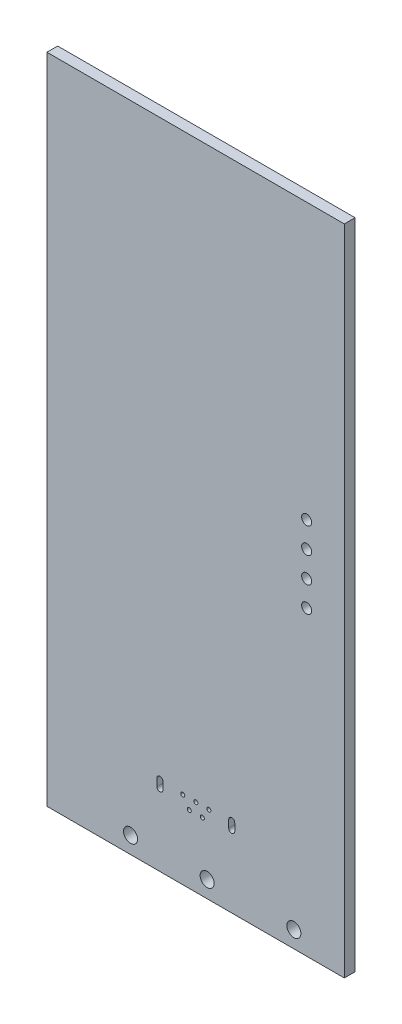
ISO-10303-21;
HEADER;
FILE_DESCRIPTION(('STEP AP214'),'2;1');
FILE_NAME('part.step','',(''),(''),'','','');
FILE_SCHEMA(('AUTOMOTIVE_DESIGN { 1 0 10303 214 1 1 1 1 }'));
ENDSEC;
DATA;
#1=APPLICATION_CONTEXT('core data for automotive mechanical design processes');
#2=APPLICATION_PROTOCOL_DEFINITION('international standard','automotive_design',2000,#1);
#3=PRODUCT_CONTEXT('',#1,'mechanical');
#4=PRODUCT('Part','Part','',(#3));
#5=PRODUCT_RELATED_PRODUCT_CATEGORY('part','',(#4));
#6=PRODUCT_DEFINITION_FORMATION('','',#4);
#7=PRODUCT_DEFINITION_CONTEXT('part definition',#1,'design');
#8=PRODUCT_DEFINITION('design','',#6,#7);
#9=PRODUCT_DEFINITION_SHAPE('','',#8);
#10=(LENGTH_UNIT() NAMED_UNIT(*) SI_UNIT(.MILLI.,.METRE.));
#11=(NAMED_UNIT(*) PLANE_ANGLE_UNIT() SI_UNIT($,.RADIAN.));
#12=(NAMED_UNIT(*) SI_UNIT($,.STERADIAN.) SOLID_ANGLE_UNIT());
#13=UNCERTAINTY_MEASURE_WITH_UNIT(LENGTH_MEASURE(1.E-05),#10,'distance_accuracy_value','');
#14=(GEOMETRIC_REPRESENTATION_CONTEXT(3) GLOBAL_UNCERTAINTY_ASSIGNED_CONTEXT((#13)) GLOBAL_UNIT_ASSIGNED_CONTEXT((#10,
#11,#12)) REPRESENTATION_CONTEXT('',''));
#15=CARTESIAN_POINT('',(0.,0.,0.));
#16=DIRECTION('',(0.,0.,1.));
#17=DIRECTION('',(1.,0.,0.));
#18=AXIS2_PLACEMENT_3D('',#15,#16,#17);
#19=CARTESIAN_POINT('',(86.68103,54.08662,1.07112));
#20=DIRECTION('',(-1.,0.,0.));
#21=DIRECTION('',(0.,0.,1.));
#22=AXIS2_PLACEMENT_3D('',#19,#20,#21);
#23=PLANE('',#22);
#24=DIRECTION('',(0.,1.,0.));
#25=VECTOR('',#24,1.);
#26=CARTESIAN_POINT('',(86.68103,54.08662,0.));
#27=LINE('',#26,#25);
#28=CARTESIAN_POINT('',(86.68103,54.08662,0.));
#29=VERTEX_POINT('',#28);
#30=CARTESIAN_POINT('',(86.68103,119.08662,0.));
#31=VERTEX_POINT('',#30);
#32=EDGE_CURVE('E247',#29,#31,#27,.T.);
#33=ORIENTED_EDGE('',*,*,#32,.T.);
#34=DIRECTION('',(0.,0.,-1.));
#35=VECTOR('',#34,1.);
#36=CARTESIAN_POINT('',(86.68103,119.08662,1.07112));
#37=LINE('',#36,#35);
#38=CARTESIAN_POINT('',(86.68103,119.08662,1.07112));
#39=VERTEX_POINT('',#38);
#40=EDGE_CURVE('E13',#39,#31,#37,.T.);
#41=ORIENTED_EDGE('',*,*,#40,.F.);
#42=DIRECTION('',(0.,1.,0.));
#43=VECTOR('',#42,1.);
#44=CARTESIAN_POINT('',(86.68103,54.08662,1.07112));
#45=LINE('',#44,#43);
#46=CARTESIAN_POINT('',(86.68103,54.08662,1.07112));
#47=VERTEX_POINT('',#46);
#48=EDGE_CURVE('E250',#47,#39,#45,.T.);
#49=ORIENTED_EDGE('',*,*,#48,.F.);
#50=DIRECTION('',(0.,0.,-1.));
#51=VECTOR('',#50,1.);
#52=CARTESIAN_POINT('',(86.68103,54.08662,1.07112));
#53=LINE('',#52,#51);
#54=EDGE_CURVE('E260',#47,#29,#53,.T.);
#55=ORIENTED_EDGE('',*,*,#54,.T.);
#56=EDGE_LOOP('',(#33,#41,#49,#55));
#57=FACE_BOUND('',#56,.T.);
#58=ADVANCED_FACE('F47',(#57),#23,.F.);
#59=CARTESIAN_POINT('',(86.68103,119.08662,1.07112));
#60=DIRECTION('',(0.,-1.,0.));
#61=DIRECTION('',(0.,0.,-1.));
#62=AXIS2_PLACEMENT_3D('',#59,#60,#61);
#63=PLANE('',#62);
#64=DIRECTION('',(-1.,0.,0.));
#65=VECTOR('',#64,1.);
#66=CARTESIAN_POINT('',(86.68103,119.08662,0.));
#67=LINE('',#66,#65);
#68=CARTESIAN_POINT('',(57.08103,119.08662,0.));
#69=VERTEX_POINT('',#68);
#70=EDGE_CURVE('E263',#31,#69,#67,.T.);
#71=ORIENTED_EDGE('',*,*,#70,.T.);
#72=DIRECTION('',(0.,0.,-1.));
#73=VECTOR('',#72,1.);
#74=CARTESIAN_POINT('',(57.08103,119.08662,1.07112));
#75=LINE('',#74,#73);
#76=CARTESIAN_POINT('',(57.08103,119.08662,1.07112));
#77=VERTEX_POINT('',#76);
#78=EDGE_CURVE('E54',#77,#69,#75,.T.);
#79=ORIENTED_EDGE('',*,*,#78,.F.);
#80=DIRECTION('',(-1.,0.,0.));
#81=VECTOR('',#80,1.);
#82=CARTESIAN_POINT('',(86.68103,119.08662,1.07112));
#83=LINE('',#82,#81);
#84=EDGE_CURVE('E253',#39,#77,#83,.T.);
#85=ORIENTED_EDGE('',*,*,#84,.F.);
#86=ORIENTED_EDGE('',*,*,#40,.T.);
#87=EDGE_LOOP('',(#71,#79,#85,#86));
#88=FACE_BOUND('',#87,.T.);
#89=ADVANCED_FACE('F292',(#88),#63,.F.);
#90=CARTESIAN_POINT('',(57.08103,119.08662,1.07112));
#91=DIRECTION('',(1.,0.,0.));
#92=DIRECTION('',(0.,0.,-1.));
#93=AXIS2_PLACEMENT_3D('',#90,#91,#92);
#94=PLANE('',#93);
#95=DIRECTION('',(0.,-1.,0.));
#96=VECTOR('',#95,1.);
#97=CARTESIAN_POINT('',(57.08103,119.08662,0.));
#98=LINE('',#97,#96);
#99=CARTESIAN_POINT('',(57.08103,54.08662,0.));
#100=VERTEX_POINT('',#99);
#101=EDGE_CURVE('E265',#69,#100,#98,.T.);
#102=ORIENTED_EDGE('',*,*,#101,.T.);
#103=DIRECTION('',(0.,0.,-1.));
#104=VECTOR('',#103,1.);
#105=CARTESIAN_POINT('',(57.08103,54.08662,1.07112));
#106=LINE('',#105,#104);
#107=CARTESIAN_POINT('',(57.08103,54.08662,1.07112));
#108=VERTEX_POINT('',#107);
#109=EDGE_CURVE('E270',#108,#100,#106,.T.);
#110=ORIENTED_EDGE('',*,*,#109,.F.);
#111=DIRECTION('',(0.,-1.,0.));
#112=VECTOR('',#111,1.);
#113=CARTESIAN_POINT('',(57.08103,119.08662,1.07112));
#114=LINE('',#113,#112);
#115=EDGE_CURVE('E256',#77,#108,#114,.T.);
#116=ORIENTED_EDGE('',*,*,#115,.F.);
#117=ORIENTED_EDGE('',*,*,#78,.T.);
#118=EDGE_LOOP('',(#102,#110,#116,#117));
#119=FACE_BOUND('',#118,.T.);
#120=ADVANCED_FACE('F277',(#119),#94,.F.);
#121=CARTESIAN_POINT('',(57.08103,54.08662,1.07112));
#122=DIRECTION('',(0.,1.,0.));
#123=DIRECTION('',(0.,0.,1.));
#124=AXIS2_PLACEMENT_3D('',#121,#122,#123);
#125=PLANE('',#124);
#126=DIRECTION('',(1.,0.,0.));
#127=VECTOR('',#126,1.);
#128=CARTESIAN_POINT('',(57.08103,54.08662,0.));
#129=LINE('',#128,#127);
#130=EDGE_CURVE('E254',#100,#29,#129,.T.);
#131=ORIENTED_EDGE('',*,*,#130,.T.);
#132=ORIENTED_EDGE('',*,*,#54,.F.);
#133=DIRECTION('',(1.,0.,0.));
#134=VECTOR('',#133,1.);
#135=CARTESIAN_POINT('',(57.08103,54.08662,1.07112));
#136=LINE('',#135,#134);
#137=EDGE_CURVE('E258',#108,#47,#136,.T.);
#138=ORIENTED_EDGE('',*,*,#137,.F.);
#139=ORIENTED_EDGE('',*,*,#109,.T.);
#140=EDGE_LOOP('',(#131,#132,#138,#139));
#141=FACE_BOUND('',#140,.T.);
#142=ADVANCED_FACE('F285',(#141),#125,.F.);
#143=CARTESIAN_POINT('',(0.,0.,1.07112));
#144=DIRECTION('',(0.,0.,1.));
#145=DIRECTION('',(1.,0.,0.));
#146=AXIS2_PLACEMENT_3D('',#143,#144,#145);
#147=PLANE('',#146);
#148=CARTESIAN_POINT('',(73.20089,61.85158,1.07112));
#149=DIRECTION('',(0.,0.,1.));
#150=DIRECTION('',(1.,0.,0.));
#151=AXIS2_PLACEMENT_3D('',#148,#149,#150);
#152=CIRCLE('',#151,0.200000000000006);
#153=CARTESIAN_POINT('',(73.40089,61.85158,1.07112));
#154=VERTEX_POINT('',#153);
#155=EDGE_CURVE('E390',#154,#154,#152,.T.);
#156=ORIENTED_EDGE('',*,*,#155,.F.);
#157=EDGE_LOOP('',(#156));
#158=FACE_BOUND('',#157,.T.);
#159=CARTESIAN_POINT('',(72.55091,60.85157,1.07112));
#160=DIRECTION('',(0.,0.,1.));
#161=DIRECTION('',(1.,0.,0.));
#162=AXIS2_PLACEMENT_3D('',#159,#160,#161);
#163=CIRCLE('',#162,0.200000000000006);
#164=CARTESIAN_POINT('',(72.75091,60.85157,1.07112));
#165=VERTEX_POINT('',#164);
#166=EDGE_CURVE('E392',#165,#165,#163,.T.);
#167=ORIENTED_EDGE('',*,*,#166,.F.);
#168=EDGE_LOOP('',(#167));
#169=FACE_BOUND('',#168,.T.);
#170=CARTESIAN_POINT('',(71.90091,61.85157,1.07112));
#171=DIRECTION('',(0.,0.,1.));
#172=DIRECTION('',(1.,0.,0.));
#173=AXIS2_PLACEMENT_3D('',#170,#171,#172);
#174=CIRCLE('',#173,0.200000000000006);
#175=CARTESIAN_POINT('',(72.10091,61.85157,1.07112));
#176=VERTEX_POINT('',#175);
#177=EDGE_CURVE('E398',#176,#176,#174,.T.);
#178=ORIENTED_EDGE('',*,*,#177,.F.);
#179=EDGE_LOOP('',(#178));
#180=FACE_BOUND('',#179,.T.);
#181=CARTESIAN_POINT('',(71.25089,60.85157,1.07112));
#182=DIRECTION('',(0.,0.,1.));
#183=DIRECTION('',(1.,0.,0.));
#184=AXIS2_PLACEMENT_3D('',#181,#182,#183);
#185=CIRCLE('',#184,0.200000000000006);
#186=CARTESIAN_POINT('',(71.45089,60.85157,1.07112));
#187=VERTEX_POINT('',#186);
#188=EDGE_CURVE('E404',#187,#187,#185,.T.);
#189=ORIENTED_EDGE('',*,*,#188,.F.);
#190=EDGE_LOOP('',(#189));
#191=FACE_BOUND('',#190,.T.);
#192=CARTESIAN_POINT('',(70.6009,61.85156,1.07112));
#193=DIRECTION('',(0.,0.,1.));
#194=DIRECTION('',(1.,0.,0.));
#195=AXIS2_PLACEMENT_3D('',#192,#193,#194);
#196=CIRCLE('',#195,0.200000000000006);
#197=CARTESIAN_POINT('',(70.8009,61.85156,1.07112));
#198=VERTEX_POINT('',#197);
#199=EDGE_CURVE('E159',#198,#198,#196,.T.);
#200=ORIENTED_EDGE('',*,*,#199,.F.);
#201=EDGE_LOOP('',(#200));
#202=FACE_BOUND('',#201,.T.);
#203=CARTESIAN_POINT('',(75.47589,61.25658,1.07112));
#204=DIRECTION('',(0.,0.,1.));
#205=DIRECTION('',(1.,0.,0.));
#206=AXIS2_PLACEMENT_3D('',#203,#204,#205);
#207=CIRCLE('',#206,0.299999999999995);
#208=CARTESIAN_POINT('',(75.17589,61.25658,1.07112));
#209=VERTEX_POINT('',#208);
#210=CARTESIAN_POINT('',(75.77589,61.25658,1.07112));
#211=VERTEX_POINT('',#210);
#212=EDGE_CURVE('E61',#209,#211,#207,.T.);
#213=ORIENTED_EDGE('',*,*,#212,.F.);
#214=DIRECTION('',(0.,-1.,0.));
#215=VECTOR('',#214,1.);
#216=CARTESIAN_POINT('',(75.17589,61.25658,1.07112));
#217=LINE('',#216,#215);
#218=CARTESIAN_POINT('',(75.17589,62.00658,1.07112));
#219=VERTEX_POINT('',#218);
#220=EDGE_CURVE('E153',#219,#209,#217,.T.);
#221=ORIENTED_EDGE('',*,*,#220,.F.);
#222=CARTESIAN_POINT('',(75.47589,62.00658,1.07112));
#223=DIRECTION('',(0.,0.,1.));
#224=DIRECTION('',(1.,0.,0.));
#225=AXIS2_PLACEMENT_3D('',#222,#223,#224);
#226=CIRCLE('',#225,0.299999999999995);
#227=CARTESIAN_POINT('',(75.77589,62.00658,1.07112));
#228=VERTEX_POINT('',#227);
#229=EDGE_CURVE('E156',#228,#219,#226,.T.);
#230=ORIENTED_EDGE('',*,*,#229,.F.);
#231=DIRECTION('',(0.,1.,0.));
#232=VECTOR('',#231,1.);
#233=CARTESIAN_POINT('',(75.77589,61.25658,1.07112));
#234=LINE('',#233,#232);
#235=EDGE_CURVE('E165',#211,#228,#234,.T.);
#236=ORIENTED_EDGE('',*,*,#235,.F.);
#237=EDGE_LOOP('',(#213,#221,#230,#236));
#238=FACE_BOUND('',#237,.T.);
#239=CARTESIAN_POINT('',(68.3259,61.25658,1.07112));
#240=DIRECTION('',(0.,0.,1.));
#241=DIRECTION('',(1.,0.,0.));
#242=AXIS2_PLACEMENT_3D('',#239,#240,#241);
#243=CIRCLE('',#242,0.299999999999995);
#244=CARTESIAN_POINT('',(68.0259,61.25658,1.07112));
#245=VERTEX_POINT('',#244);
#246=CARTESIAN_POINT('',(68.6259,61.25658,1.07112));
#247=VERTEX_POINT('',#246);
#248=EDGE_CURVE('E172',#245,#247,#243,.T.);
#249=ORIENTED_EDGE('',*,*,#248,.F.);
#250=DIRECTION('',(0.,-1.,0.));
#251=VECTOR('',#250,1.);
#252=CARTESIAN_POINT('',(68.0259,61.25658,1.07112));
#253=LINE('',#252,#251);
#254=CARTESIAN_POINT('',(68.0259,62.00658,1.07112));
#255=VERTEX_POINT('',#254);
#256=EDGE_CURVE('E180',#255,#245,#253,.T.);
#257=ORIENTED_EDGE('',*,*,#256,.F.);
#258=CARTESIAN_POINT('',(68.3259,62.00658,1.07112));
#259=DIRECTION('',(0.,0.,1.));
#260=DIRECTION('',(1.,0.,0.));
#261=AXIS2_PLACEMENT_3D('',#258,#259,#260);
#262=CIRCLE('',#261,0.299999999999995);
#263=CARTESIAN_POINT('',(68.6259,62.00658,1.07112));
#264=VERTEX_POINT('',#263);
#265=EDGE_CURVE('E194',#264,#255,#262,.T.);
#266=ORIENTED_EDGE('',*,*,#265,.F.);
#267=DIRECTION('',(0.,1.,0.));
#268=VECTOR('',#267,1.);
#269=CARTESIAN_POINT('',(68.6259,61.25658,1.07112));
#270=LINE('',#269,#268);
#271=EDGE_CURVE('E191',#247,#264,#270,.T.);
#272=ORIENTED_EDGE('',*,*,#271,.F.);
#273=EDGE_LOOP('',(#249,#257,#266,#272));
#274=FACE_BOUND('',#273,.T.);
#275=CARTESIAN_POINT('',(65.405,55.753,1.07112));
#276=DIRECTION('',(0.,0.,1.));
#277=DIRECTION('',(1.,0.,0.));
#278=AXIS2_PLACEMENT_3D('',#275,#276,#277);
#279=CIRCLE('',#278,0.700000000000006);
#280=CARTESIAN_POINT('',(66.105,55.753,1.07112));
#281=VERTEX_POINT('',#280);
#282=EDGE_CURVE('E201',#281,#281,#279,.T.);
#283=ORIENTED_EDGE('',*,*,#282,.F.);
#284=EDGE_LOOP('',(#283));
#285=FACE_BOUND('',#284,.T.);
#286=CARTESIAN_POINT('',(81.661,55.753,1.07112));
#287=DIRECTION('',(0.,0.,1.));
#288=DIRECTION('',(1.,0.,0.));
#289=AXIS2_PLACEMENT_3D('',#286,#287,#288);
#290=CIRCLE('',#289,0.700000000000006);
#291=CARTESIAN_POINT('',(82.361,55.753,1.07112));
#292=VERTEX_POINT('',#291);
#293=EDGE_CURVE('E211',#292,#292,#290,.T.);
#294=ORIENTED_EDGE('',*,*,#293,.F.);
#295=EDGE_LOOP('',(#294));
#296=FACE_BOUND('',#295,.T.);
#297=CARTESIAN_POINT('',(73.025,55.753,1.07112));
#298=DIRECTION('',(0.,0.,1.));
#299=DIRECTION('',(1.,0.,0.));
#300=AXIS2_PLACEMENT_3D('',#297,#298,#299);
#301=CIRCLE('',#300,0.700000000000006);
#302=CARTESIAN_POINT('',(73.725,55.753,1.07112));
#303=VERTEX_POINT('',#302);
#304=EDGE_CURVE('E217',#303,#303,#301,.T.);
#305=ORIENTED_EDGE('',*,*,#304,.F.);
#306=EDGE_LOOP('',(#305));
#307=FACE_BOUND('',#306,.T.);
#308=CARTESIAN_POINT('',(82.931,91.71263,1.07112));
#309=DIRECTION('',(0.,0.,1.));
#310=DIRECTION('',(1.,0.,0.));
#311=AXIS2_PLACEMENT_3D('',#308,#309,#310);
#312=CIRCLE('',#311,0.5);
#313=CARTESIAN_POINT('',(83.431,91.71263,1.07112));
#314=VERTEX_POINT('',#313);
#315=EDGE_CURVE('E223',#314,#314,#312,.T.);
#316=ORIENTED_EDGE('',*,*,#315,.F.);
#317=EDGE_LOOP('',(#316));
#318=FACE_BOUND('',#317,.T.);
#319=CARTESIAN_POINT('',(82.931,89.17263,1.07112));
#320=DIRECTION('',(0.,0.,1.));
#321=DIRECTION('',(1.,0.,0.));
#322=AXIS2_PLACEMENT_3D('',#319,#320,#321);
#323=CIRCLE('',#322,0.5);
#324=CARTESIAN_POINT('',(83.431,89.17263,1.07112));
#325=VERTEX_POINT('',#324);
#326=EDGE_CURVE('E229',#325,#325,#323,.T.);
#327=ORIENTED_EDGE('',*,*,#326,.F.);
#328=EDGE_LOOP('',(#327));
#329=FACE_BOUND('',#328,.T.);
#330=CARTESIAN_POINT('',(82.931,86.63263,1.07112));
#331=DIRECTION('',(0.,0.,1.));
#332=DIRECTION('',(1.,0.,0.));
#333=AXIS2_PLACEMENT_3D('',#330,#331,#332);
#334=CIRCLE('',#333,0.5);
#335=CARTESIAN_POINT('',(83.431,86.63263,1.07112));
#336=VERTEX_POINT('',#335);
#337=EDGE_CURVE('E235',#336,#336,#334,.T.);
#338=ORIENTED_EDGE('',*,*,#337,.F.);
#339=EDGE_LOOP('',(#338));
#340=FACE_BOUND('',#339,.T.);
#341=CARTESIAN_POINT('',(82.93099,84.09263,1.07112));
#342=DIRECTION('',(0.,0.,1.));
#343=DIRECTION('',(1.,0.,0.));
#344=AXIS2_PLACEMENT_3D('',#341,#342,#343);
#345=CIRCLE('',#344,0.5);
#346=CARTESIAN_POINT('',(83.43099,84.09263,1.07112));
#347=VERTEX_POINT('',#346);
#348=EDGE_CURVE('E241',#347,#347,#345,.T.);
#349=ORIENTED_EDGE('',*,*,#348,.F.);
#350=EDGE_LOOP('',(#349));
#351=FACE_BOUND('',#350,.T.);
#352=ORIENTED_EDGE('',*,*,#48,.T.);
#353=ORIENTED_EDGE('',*,*,#84,.T.);
#354=ORIENTED_EDGE('',*,*,#115,.T.);
#355=ORIENTED_EDGE('',*,*,#137,.T.);
#356=EDGE_LOOP('',(#352,#353,#354,#355));
#357=FACE_BOUND('',#356,.T.);
#358=ADVANCED_FACE('F291',(#158,#169,#180,#191,#202,#238,#274,#285,#296,#307,#318,#329,#340,
#351,#357),#147,.T.);
#359=CARTESIAN_POINT('',(0.,0.,0.));
#360=DIRECTION('',(0.,0.,1.));
#361=DIRECTION('',(1.,0.,0.));
#362=AXIS2_PLACEMENT_3D('',#359,#360,#361);
#363=PLANE('',#362);
#364=CARTESIAN_POINT('',(73.20089,61.85158,0.));
#365=DIRECTION('',(0.,0.,1.));
#366=DIRECTION('',(1.,0.,0.));
#367=AXIS2_PLACEMENT_3D('',#364,#365,#366);
#368=CIRCLE('',#367,0.200000000000006);
#369=CARTESIAN_POINT('',(73.40089,61.85158,0.));
#370=VERTEX_POINT('',#369);
#371=EDGE_CURVE('E387',#370,#370,#368,.T.);
#372=ORIENTED_EDGE('',*,*,#371,.T.);
#373=EDGE_LOOP('',(#372));
#374=FACE_BOUND('',#373,.T.);
#375=CARTESIAN_POINT('',(72.55091,60.85157,0.));
#376=DIRECTION('',(0.,0.,1.));
#377=DIRECTION('',(1.,0.,0.));
#378=AXIS2_PLACEMENT_3D('',#375,#376,#377);
#379=CIRCLE('',#378,0.200000000000006);
#380=CARTESIAN_POINT('',(72.75091,60.85157,0.));
#381=VERTEX_POINT('',#380);
#382=EDGE_CURVE('E395',#381,#381,#379,.T.);
#383=ORIENTED_EDGE('',*,*,#382,.T.);
#384=EDGE_LOOP('',(#383));
#385=FACE_BOUND('',#384,.T.);
#386=CARTESIAN_POINT('',(71.90091,61.85157,0.));
#387=DIRECTION('',(0.,0.,1.));
#388=DIRECTION('',(1.,0.,0.));
#389=AXIS2_PLACEMENT_3D('',#386,#387,#388);
#390=CIRCLE('',#389,0.200000000000006);
#391=CARTESIAN_POINT('',(72.10091,61.85157,0.));
#392=VERTEX_POINT('',#391);
#393=EDGE_CURVE('E401',#392,#392,#390,.T.);
#394=ORIENTED_EDGE('',*,*,#393,.T.);
#395=EDGE_LOOP('',(#394));
#396=FACE_BOUND('',#395,.T.);
#397=CARTESIAN_POINT('',(71.25089,60.85157,0.));
#398=DIRECTION('',(0.,0.,1.));
#399=DIRECTION('',(1.,0.,0.));
#400=AXIS2_PLACEMENT_3D('',#397,#398,#399);
#401=CIRCLE('',#400,0.200000000000006);
#402=CARTESIAN_POINT('',(71.45089,60.85157,0.));
#403=VERTEX_POINT('',#402);
#404=EDGE_CURVE('E407',#403,#403,#401,.T.);
#405=ORIENTED_EDGE('',*,*,#404,.T.);
#406=EDGE_LOOP('',(#405));
#407=FACE_BOUND('',#406,.T.);
#408=CARTESIAN_POINT('',(70.6009,61.85156,0.));
#409=DIRECTION('',(0.,0.,1.));
#410=DIRECTION('',(1.,0.,0.));
#411=AXIS2_PLACEMENT_3D('',#408,#409,#410);
#412=CIRCLE('',#411,0.200000000000006);
#413=CARTESIAN_POINT('',(70.8009,61.85156,0.));
#414=VERTEX_POINT('',#413);
#415=EDGE_CURVE('E166',#414,#414,#412,.T.);
#416=ORIENTED_EDGE('',*,*,#415,.T.);
#417=EDGE_LOOP('',(#416));
#418=FACE_BOUND('',#417,.T.);
#419=DIRECTION('',(0.,-1.,0.));
#420=VECTOR('',#419,1.);
#421=CARTESIAN_POINT('',(75.17589,61.25658,0.));
#422=LINE('',#421,#420);
#423=CARTESIAN_POINT('',(75.17589,62.00658,0.));
#424=VERTEX_POINT('',#423);
#425=CARTESIAN_POINT('',(75.17589,61.25658,0.));
#426=VERTEX_POINT('',#425);
#427=EDGE_CURVE('E143',#424,#426,#422,.T.);
#428=ORIENTED_EDGE('',*,*,#427,.T.);
#429=CARTESIAN_POINT('',(75.47589,61.25658,0.));
#430=DIRECTION('',(0.,0.,1.));
#431=DIRECTION('',(1.,0.,0.));
#432=AXIS2_PLACEMENT_3D('',#429,#430,#431);
#433=CIRCLE('',#432,0.299999999999995);
#434=CARTESIAN_POINT('',(75.77589,61.25658,0.));
#435=VERTEX_POINT('',#434);
#436=EDGE_CURVE('E137',#426,#435,#433,.T.);
#437=ORIENTED_EDGE('',*,*,#436,.T.);
#438=DIRECTION('',(0.,1.,0.));
#439=VECTOR('',#438,1.);
#440=CARTESIAN_POINT('',(75.77589,61.25658,0.));
#441=LINE('',#440,#439);
#442=CARTESIAN_POINT('',(75.77589,62.00658,0.));
#443=VERTEX_POINT('',#442);
#444=EDGE_CURVE('E146',#435,#443,#441,.T.);
#445=ORIENTED_EDGE('',*,*,#444,.T.);
#446=CARTESIAN_POINT('',(75.47589,62.00658,0.));
#447=DIRECTION('',(0.,0.,1.));
#448=DIRECTION('',(1.,0.,0.));
#449=AXIS2_PLACEMENT_3D('',#446,#447,#448);
#450=CIRCLE('',#449,0.299999999999995);
#451=EDGE_CURVE('E69',#443,#424,#450,.T.);
#452=ORIENTED_EDGE('',*,*,#451,.T.);
#453=EDGE_LOOP('',(#428,#437,#445,#452));
#454=FACE_BOUND('',#453,.T.);
#455=DIRECTION('',(0.,-1.,0.));
#456=VECTOR('',#455,1.);
#457=CARTESIAN_POINT('',(68.0259,61.25658,0.));
#458=LINE('',#457,#456);
#459=CARTESIAN_POINT('',(68.0259,62.00658,0.));
#460=VERTEX_POINT('',#459);
#461=CARTESIAN_POINT('',(68.0259,61.25658,0.));
#462=VERTEX_POINT('',#461);
#463=EDGE_CURVE('E186',#460,#462,#458,.T.);
#464=ORIENTED_EDGE('',*,*,#463,.T.);
#465=CARTESIAN_POINT('',(68.3259,61.25658,0.));
#466=DIRECTION('',(0.,0.,1.));
#467=DIRECTION('',(1.,0.,0.));
#468=AXIS2_PLACEMENT_3D('',#465,#466,#467);
#469=CIRCLE('',#468,0.299999999999995);
#470=CARTESIAN_POINT('',(68.6259,61.25658,0.));
#471=VERTEX_POINT('',#470);
#472=EDGE_CURVE('E176',#462,#471,#469,.T.);
#473=ORIENTED_EDGE('',*,*,#472,.T.);
#474=DIRECTION('',(0.,1.,0.));
#475=VECTOR('',#474,1.);
#476=CARTESIAN_POINT('',(68.6259,61.25658,0.));
#477=LINE('',#476,#475);
#478=CARTESIAN_POINT('',(68.6259,62.00658,0.));
#479=VERTEX_POINT('',#478);
#480=EDGE_CURVE('E179',#471,#479,#477,.T.);
#481=ORIENTED_EDGE('',*,*,#480,.T.);
#482=CARTESIAN_POINT('',(68.3259,62.00658,0.));
#483=DIRECTION('',(0.,0.,1.));
#484=DIRECTION('',(1.,0.,0.));
#485=AXIS2_PLACEMENT_3D('',#482,#483,#484);
#486=CIRCLE('',#485,0.299999999999995);
#487=EDGE_CURVE('E183',#479,#460,#486,.T.);
#488=ORIENTED_EDGE('',*,*,#487,.T.);
#489=EDGE_LOOP('',(#464,#473,#481,#488));
#490=FACE_BOUND('',#489,.T.);
#491=CARTESIAN_POINT('',(65.405,55.753,0.));
#492=DIRECTION('',(0.,0.,1.));
#493=DIRECTION('',(1.,0.,0.));
#494=AXIS2_PLACEMENT_3D('',#491,#492,#493);
#495=CIRCLE('',#494,0.700000000000006);
#496=CARTESIAN_POINT('',(66.105,55.753,0.));
#497=VERTEX_POINT('',#496);
#498=EDGE_CURVE('E208',#497,#497,#495,.T.);
#499=ORIENTED_EDGE('',*,*,#498,.T.);
#500=EDGE_LOOP('',(#499));
#501=FACE_BOUND('',#500,.T.);
#502=CARTESIAN_POINT('',(81.661,55.753,0.));
#503=DIRECTION('',(0.,0.,1.));
#504=DIRECTION('',(1.,0.,0.));
#505=AXIS2_PLACEMENT_3D('',#502,#503,#504);
#506=CIRCLE('',#505,0.700000000000006);
#507=CARTESIAN_POINT('',(82.361,55.753,0.));
#508=VERTEX_POINT('',#507);
#509=EDGE_CURVE('E214',#508,#508,#506,.T.);
#510=ORIENTED_EDGE('',*,*,#509,.T.);
#511=EDGE_LOOP('',(#510));
#512=FACE_BOUND('',#511,.T.);
#513=CARTESIAN_POINT('',(73.025,55.753,0.));
#514=DIRECTION('',(0.,0.,1.));
#515=DIRECTION('',(1.,0.,0.));
#516=AXIS2_PLACEMENT_3D('',#513,#514,#515);
#517=CIRCLE('',#516,0.700000000000006);
#518=CARTESIAN_POINT('',(73.725,55.753,0.));
#519=VERTEX_POINT('',#518);
#520=EDGE_CURVE('E220',#519,#519,#517,.T.);
#521=ORIENTED_EDGE('',*,*,#520,.T.);
#522=EDGE_LOOP('',(#521));
#523=FACE_BOUND('',#522,.T.);
#524=CARTESIAN_POINT('',(82.931,91.71263,0.));
#525=DIRECTION('',(0.,0.,1.));
#526=DIRECTION('',(1.,0.,0.));
#527=AXIS2_PLACEMENT_3D('',#524,#525,#526);
#528=CIRCLE('',#527,0.5);
#529=CARTESIAN_POINT('',(83.431,91.71263,0.));
#530=VERTEX_POINT('',#529);
#531=EDGE_CURVE('E226',#530,#530,#528,.T.);
#532=ORIENTED_EDGE('',*,*,#531,.T.);
#533=EDGE_LOOP('',(#532));
#534=FACE_BOUND('',#533,.T.);
#535=CARTESIAN_POINT('',(82.931,89.17263,0.));
#536=DIRECTION('',(0.,0.,1.));
#537=DIRECTION('',(1.,0.,0.));
#538=AXIS2_PLACEMENT_3D('',#535,#536,#537);
#539=CIRCLE('',#538,0.5);
#540=CARTESIAN_POINT('',(83.431,89.17263,0.));
#541=VERTEX_POINT('',#540);
#542=EDGE_CURVE('E232',#541,#541,#539,.T.);
#543=ORIENTED_EDGE('',*,*,#542,.T.);
#544=EDGE_LOOP('',(#543));
#545=FACE_BOUND('',#544,.T.);
#546=CARTESIAN_POINT('',(82.931,86.63263,0.));
#547=DIRECTION('',(0.,0.,1.));
#548=DIRECTION('',(1.,0.,0.));
#549=AXIS2_PLACEMENT_3D('',#546,#547,#548);
#550=CIRCLE('',#549,0.5);
#551=CARTESIAN_POINT('',(83.431,86.63263,0.));
#552=VERTEX_POINT('',#551);
#553=EDGE_CURVE('E238',#552,#552,#550,.T.);
#554=ORIENTED_EDGE('',*,*,#553,.T.);
#555=EDGE_LOOP('',(#554));
#556=FACE_BOUND('',#555,.T.);
#557=CARTESIAN_POINT('',(82.93099,84.09263,0.));
#558=DIRECTION('',(0.,0.,1.));
#559=DIRECTION('',(1.,0.,0.));
#560=AXIS2_PLACEMENT_3D('',#557,#558,#559);
#561=CIRCLE('',#560,0.5);
#562=CARTESIAN_POINT('',(83.43099,84.09263,0.));
#563=VERTEX_POINT('',#562);
#564=EDGE_CURVE('E244',#563,#563,#561,.T.);
#565=ORIENTED_EDGE('',*,*,#564,.T.);
#566=EDGE_LOOP('',(#565));
#567=FACE_BOUND('',#566,.T.);
#568=ORIENTED_EDGE('',*,*,#32,.F.);
#569=ORIENTED_EDGE('',*,*,#130,.F.);
#570=ORIENTED_EDGE('',*,*,#101,.F.);
#571=ORIENTED_EDGE('',*,*,#70,.F.);
#572=EDGE_LOOP('',(#568,#569,#570,#571));
#573=FACE_BOUND('',#572,.T.);
#574=ADVANCED_FACE('F150',(#374,#385,#396,#407,#418,#454,#490,#501,#512,#523,#534,#545,#556,
#567,#573),#363,.F.);
#575=CARTESIAN_POINT('',(82.93099,84.09263,0.));
#576=DIRECTION('',(0.,0.,1.));
#577=DIRECTION('',(1.,0.,0.));
#578=AXIS2_PLACEMENT_3D('',#575,#576,#577);
#579=CYLINDRICAL_SURFACE('',#578,0.5);
#580=ORIENTED_EDGE('',*,*,#564,.F.);
#581=EDGE_LOOP('',(#580));
#582=FACE_BOUND('',#581,.T.);
#583=ORIENTED_EDGE('',*,*,#348,.T.);
#584=EDGE_LOOP('',(#583));
#585=FACE_BOUND('',#584,.T.);
#586=ADVANCED_FACE('F304',(#582,#585),#579,.F.);
#587=CARTESIAN_POINT('',(82.931,86.63263,0.));
#588=DIRECTION('',(0.,0.,1.));
#589=DIRECTION('',(1.,0.,0.));
#590=AXIS2_PLACEMENT_3D('',#587,#588,#589);
#591=CYLINDRICAL_SURFACE('',#590,0.5);
#592=ORIENTED_EDGE('',*,*,#553,.F.);
#593=EDGE_LOOP('',(#592));
#594=FACE_BOUND('',#593,.T.);
#595=ORIENTED_EDGE('',*,*,#337,.T.);
#596=EDGE_LOOP('',(#595));
#597=FACE_BOUND('',#596,.T.);
#598=ADVANCED_FACE('F311',(#594,#597),#591,.F.);
#599=CARTESIAN_POINT('',(82.931,89.17263,0.));
#600=DIRECTION('',(0.,0.,1.));
#601=DIRECTION('',(1.,0.,0.));
#602=AXIS2_PLACEMENT_3D('',#599,#600,#601);
#603=CYLINDRICAL_SURFACE('',#602,0.5);
#604=ORIENTED_EDGE('',*,*,#542,.F.);
#605=EDGE_LOOP('',(#604));
#606=FACE_BOUND('',#605,.T.);
#607=ORIENTED_EDGE('',*,*,#326,.T.);
#608=EDGE_LOOP('',(#607));
#609=FACE_BOUND('',#608,.T.);
#610=ADVANCED_FACE('F315',(#606,#609),#603,.F.);
#611=CARTESIAN_POINT('',(82.931,91.71263,0.));
#612=DIRECTION('',(0.,0.,1.));
#613=DIRECTION('',(1.,0.,0.));
#614=AXIS2_PLACEMENT_3D('',#611,#612,#613);
#615=CYLINDRICAL_SURFACE('',#614,0.5);
#616=ORIENTED_EDGE('',*,*,#531,.F.);
#617=EDGE_LOOP('',(#616));
#618=FACE_BOUND('',#617,.T.);
#619=ORIENTED_EDGE('',*,*,#315,.T.);
#620=EDGE_LOOP('',(#619));
#621=FACE_BOUND('',#620,.T.);
#622=ADVANCED_FACE('F319',(#618,#621),#615,.F.);
#623=CARTESIAN_POINT('',(73.025,55.753,0.));
#624=DIRECTION('',(0.,0.,1.));
#625=DIRECTION('',(1.,0.,0.));
#626=AXIS2_PLACEMENT_3D('',#623,#624,#625);
#627=CYLINDRICAL_SURFACE('',#626,0.700000000000006);
#628=ORIENTED_EDGE('',*,*,#520,.F.);
#629=EDGE_LOOP('',(#628));
#630=FACE_BOUND('',#629,.T.);
#631=ORIENTED_EDGE('',*,*,#304,.T.);
#632=EDGE_LOOP('',(#631));
#633=FACE_BOUND('',#632,.T.);
#634=ADVANCED_FACE('F323',(#630,#633),#627,.F.);
#635=CARTESIAN_POINT('',(81.661,55.753,0.));
#636=DIRECTION('',(0.,0.,1.));
#637=DIRECTION('',(1.,0.,0.));
#638=AXIS2_PLACEMENT_3D('',#635,#636,#637);
#639=CYLINDRICAL_SURFACE('',#638,0.700000000000006);
#640=ORIENTED_EDGE('',*,*,#509,.F.);
#641=EDGE_LOOP('',(#640));
#642=FACE_BOUND('',#641,.T.);
#643=ORIENTED_EDGE('',*,*,#293,.T.);
#644=EDGE_LOOP('',(#643));
#645=FACE_BOUND('',#644,.T.);
#646=ADVANCED_FACE('F327',(#642,#645),#639,.F.);
#647=CARTESIAN_POINT('',(65.405,55.753,0.));
#648=DIRECTION('',(0.,0.,1.));
#649=DIRECTION('',(1.,0.,0.));
#650=AXIS2_PLACEMENT_3D('',#647,#648,#649);
#651=CYLINDRICAL_SURFACE('',#650,0.700000000000006);
#652=ORIENTED_EDGE('',*,*,#498,.F.);
#653=EDGE_LOOP('',(#652));
#654=FACE_BOUND('',#653,.T.);
#655=ORIENTED_EDGE('',*,*,#282,.T.);
#656=EDGE_LOOP('',(#655));
#657=FACE_BOUND('',#656,.T.);
#658=ADVANCED_FACE('F331',(#654,#657),#651,.F.);
#659=CARTESIAN_POINT('',(68.3259,61.25658,0.));
#660=DIRECTION('',(0.,0.,1.));
#661=DIRECTION('',(1.,0.,0.));
#662=AXIS2_PLACEMENT_3D('',#659,#660,#661);
#663=CYLINDRICAL_SURFACE('',#662,0.299999999999995);
#664=ORIENTED_EDGE('',*,*,#248,.T.);
#665=DIRECTION('',(0.,0.,1.));
#666=VECTOR('',#665,1.);
#667=CARTESIAN_POINT('',(68.6259,61.25658,0.));
#668=LINE('',#667,#666);
#669=EDGE_CURVE('E189',#471,#247,#668,.T.);
#670=ORIENTED_EDGE('',*,*,#669,.F.);
#671=ORIENTED_EDGE('',*,*,#472,.F.);
#672=DIRECTION('',(0.,0.,1.));
#673=VECTOR('',#672,1.);
#674=CARTESIAN_POINT('',(68.0259,61.25658,0.));
#675=LINE('',#674,#673);
#676=EDGE_CURVE('E199',#462,#245,#675,.T.);
#677=ORIENTED_EDGE('',*,*,#676,.T.);
#678=EDGE_LOOP('',(#664,#670,#671,#677));
#679=FACE_BOUND('',#678,.T.);
#680=ADVANCED_FACE('F335',(#679),#663,.F.);
#681=CARTESIAN_POINT('',(68.0259,61.25658,0.));
#682=DIRECTION('',(-1.,0.,0.));
#683=DIRECTION('',(0.,0.,1.));
#684=AXIS2_PLACEMENT_3D('',#681,#682,#683);
#685=PLANE('',#684);
#686=ORIENTED_EDGE('',*,*,#256,.T.);
#687=ORIENTED_EDGE('',*,*,#676,.F.);
#688=ORIENTED_EDGE('',*,*,#463,.F.);
#689=DIRECTION('',(0.,0.,1.));
#690=VECTOR('',#689,1.);
#691=CARTESIAN_POINT('',(68.0259,62.00658,0.));
#692=LINE('',#691,#690);
#693=EDGE_CURVE('E202',#460,#255,#692,.T.);
#694=ORIENTED_EDGE('',*,*,#693,.T.);
#695=EDGE_LOOP('',(#686,#687,#688,#694));
#696=FACE_BOUND('',#695,.T.);
#697=ADVANCED_FACE('F339',(#696),#685,.F.);
#698=CARTESIAN_POINT('',(68.3259,62.00658,0.));
#699=DIRECTION('',(0.,0.,1.));
#700=DIRECTION('',(1.,0.,0.));
#701=AXIS2_PLACEMENT_3D('',#698,#699,#700);
#702=CYLINDRICAL_SURFACE('',#701,0.299999999999995);
#703=ORIENTED_EDGE('',*,*,#265,.T.);
#704=ORIENTED_EDGE('',*,*,#693,.F.);
#705=ORIENTED_EDGE('',*,*,#487,.F.);
#706=DIRECTION('',(0.,0.,1.));
#707=VECTOR('',#706,1.);
#708=CARTESIAN_POINT('',(68.6259,62.00658,0.));
#709=LINE('',#708,#707);
#710=EDGE_CURVE('E204',#479,#264,#709,.T.);
#711=ORIENTED_EDGE('',*,*,#710,.T.);
#712=EDGE_LOOP('',(#703,#704,#705,#711));
#713=FACE_BOUND('',#712,.T.);
#714=ADVANCED_FACE('F344',(#713),#702,.F.);
#715=CARTESIAN_POINT('',(68.6259,61.25658,0.));
#716=DIRECTION('',(1.,0.,0.));
#717=DIRECTION('',(0.,0.,-1.));
#718=AXIS2_PLACEMENT_3D('',#715,#716,#717);
#719=PLANE('',#718);
#720=ORIENTED_EDGE('',*,*,#271,.T.);
#721=ORIENTED_EDGE('',*,*,#710,.F.);
#722=ORIENTED_EDGE('',*,*,#480,.F.);
#723=ORIENTED_EDGE('',*,*,#669,.T.);
#724=EDGE_LOOP('',(#720,#721,#722,#723));
#725=FACE_BOUND('',#724,.T.);
#726=ADVANCED_FACE('F341',(#725),#719,.F.);
#727=CARTESIAN_POINT('',(75.47589,61.25658,0.));
#728=DIRECTION('',(0.,0.,1.));
#729=DIRECTION('',(1.,0.,0.));
#730=AXIS2_PLACEMENT_3D('',#727,#728,#729);
#731=CYLINDRICAL_SURFACE('',#730,0.299999999999995);
#732=ORIENTED_EDGE('',*,*,#212,.T.);
#733=DIRECTION('',(0.,0.,1.));
#734=VECTOR('',#733,1.);
#735=CARTESIAN_POINT('',(75.77589,61.25658,0.));
#736=LINE('',#735,#734);
#737=EDGE_CURVE('E133',#435,#211,#736,.T.);
#738=ORIENTED_EDGE('',*,*,#737,.F.);
#739=ORIENTED_EDGE('',*,*,#436,.F.);
#740=DIRECTION('',(0.,0.,1.));
#741=VECTOR('',#740,1.);
#742=CARTESIAN_POINT('',(75.17589,61.25658,0.));
#743=LINE('',#742,#741);
#744=EDGE_CURVE('E170',#426,#209,#743,.T.);
#745=ORIENTED_EDGE('',*,*,#744,.T.);
#746=EDGE_LOOP('',(#732,#738,#739,#745));
#747=FACE_BOUND('',#746,.T.);
#748=ADVANCED_FACE('F135',(#747),#731,.F.);
#749=CARTESIAN_POINT('',(75.17589,61.25658,0.));
#750=DIRECTION('',(-1.,0.,0.));
#751=DIRECTION('',(0.,0.,1.));
#752=AXIS2_PLACEMENT_3D('',#749,#750,#751);
#753=PLANE('',#752);
#754=ORIENTED_EDGE('',*,*,#220,.T.);
#755=ORIENTED_EDGE('',*,*,#744,.F.);
#756=ORIENTED_EDGE('',*,*,#427,.F.);
#757=DIRECTION('',(0.,0.,1.));
#758=VECTOR('',#757,1.);
#759=CARTESIAN_POINT('',(75.17589,62.00658,0.));
#760=LINE('',#759,#758);
#761=EDGE_CURVE('E173',#424,#219,#760,.T.);
#762=ORIENTED_EDGE('',*,*,#761,.T.);
#763=EDGE_LOOP('',(#754,#755,#756,#762));
#764=FACE_BOUND('',#763,.T.);
#765=ADVANCED_FACE('F354',(#764),#753,.F.);
#766=CARTESIAN_POINT('',(75.47589,62.00658,0.));
#767=DIRECTION('',(0.,0.,1.));
#768=DIRECTION('',(1.,0.,0.));
#769=AXIS2_PLACEMENT_3D('',#766,#767,#768);
#770=CYLINDRICAL_SURFACE('',#769,0.299999999999995);
#771=ORIENTED_EDGE('',*,*,#229,.T.);
#772=ORIENTED_EDGE('',*,*,#761,.F.);
#773=ORIENTED_EDGE('',*,*,#451,.F.);
#774=DIRECTION('',(0.,0.,1.));
#775=VECTOR('',#774,1.);
#776=CARTESIAN_POINT('',(75.77589,62.00658,0.));
#777=LINE('',#776,#775);
#778=EDGE_CURVE('E142',#443,#228,#777,.T.);
#779=ORIENTED_EDGE('',*,*,#778,.T.);
#780=EDGE_LOOP('',(#771,#772,#773,#779));
#781=FACE_BOUND('',#780,.T.);
#782=ADVANCED_FACE('F358',(#781),#770,.F.);
#783=CARTESIAN_POINT('',(75.77589,61.25658,0.));
#784=DIRECTION('',(1.,0.,0.));
#785=DIRECTION('',(0.,0.,-1.));
#786=AXIS2_PLACEMENT_3D('',#783,#784,#785);
#787=PLANE('',#786);
#788=ORIENTED_EDGE('',*,*,#235,.T.);
#789=ORIENTED_EDGE('',*,*,#778,.F.);
#790=ORIENTED_EDGE('',*,*,#444,.F.);
#791=ORIENTED_EDGE('',*,*,#737,.T.);
#792=EDGE_LOOP('',(#788,#789,#790,#791));
#793=FACE_BOUND('',#792,.T.);
#794=ADVANCED_FACE('F147',(#793),#787,.F.);
#795=CARTESIAN_POINT('',(70.6009,61.85156,0.));
#796=DIRECTION('',(0.,0.,1.));
#797=DIRECTION('',(1.,0.,0.));
#798=AXIS2_PLACEMENT_3D('',#795,#796,#797);
#799=CYLINDRICAL_SURFACE('',#798,0.200000000000006);
#800=ORIENTED_EDGE('',*,*,#415,.F.);
#801=EDGE_LOOP('',(#800));
#802=FACE_BOUND('',#801,.T.);
#803=ORIENTED_EDGE('',*,*,#199,.T.);
#804=EDGE_LOOP('',(#803));
#805=FACE_BOUND('',#804,.T.);
#806=ADVANCED_FACE('F357',(#802,#805),#799,.F.);
#807=CARTESIAN_POINT('',(71.25089,60.85157,0.));
#808=DIRECTION('',(0.,0.,1.));
#809=DIRECTION('',(1.,0.,0.));
#810=AXIS2_PLACEMENT_3D('',#807,#808,#809);
#811=CYLINDRICAL_SURFACE('',#810,0.200000000000006);
#812=ORIENTED_EDGE('',*,*,#404,.F.);
#813=EDGE_LOOP('',(#812));
#814=FACE_BOUND('',#813,.T.);
#815=ORIENTED_EDGE('',*,*,#188,.T.);
#816=EDGE_LOOP('',(#815));
#817=FACE_BOUND('',#816,.T.);
#818=ADVANCED_FACE('F366',(#814,#817),#811,.F.);
#819=CARTESIAN_POINT('',(71.90091,61.85157,0.));
#820=DIRECTION('',(0.,0.,1.));
#821=DIRECTION('',(1.,0.,0.));
#822=AXIS2_PLACEMENT_3D('',#819,#820,#821);
#823=CYLINDRICAL_SURFACE('',#822,0.200000000000006);
#824=ORIENTED_EDGE('',*,*,#393,.F.);
#825=EDGE_LOOP('',(#824));
#826=FACE_BOUND('',#825,.T.);
#827=ORIENTED_EDGE('',*,*,#177,.T.);
#828=EDGE_LOOP('',(#827));
#829=FACE_BOUND('',#828,.T.);
#830=ADVANCED_FACE('F370',(#826,#829),#823,.F.);
#831=CARTESIAN_POINT('',(72.55091,60.85157,0.));
#832=DIRECTION('',(0.,0.,1.));
#833=DIRECTION('',(1.,0.,0.));
#834=AXIS2_PLACEMENT_3D('',#831,#832,#833);
#835=CYLINDRICAL_SURFACE('',#834,0.200000000000006);
#836=ORIENTED_EDGE('',*,*,#382,.F.);
#837=EDGE_LOOP('',(#836));
#838=FACE_BOUND('',#837,.T.);
#839=ORIENTED_EDGE('',*,*,#166,.T.);
#840=EDGE_LOOP('',(#839));
#841=FACE_BOUND('',#840,.T.);
#842=ADVANCED_FACE('F374',(#838,#841),#835,.F.);
#843=CARTESIAN_POINT('',(73.20089,61.85158,0.));
#844=DIRECTION('',(0.,0.,1.));
#845=DIRECTION('',(1.,0.,0.));
#846=AXIS2_PLACEMENT_3D('',#843,#844,#845);
#847=CYLINDRICAL_SURFACE('',#846,0.200000000000006);
#848=ORIENTED_EDGE('',*,*,#371,.F.);
#849=EDGE_LOOP('',(#848));
#850=FACE_BOUND('',#849,.T.);
#851=ORIENTED_EDGE('',*,*,#155,.T.);
#852=EDGE_LOOP('',(#851));
#853=FACE_BOUND('',#852,.T.);
#854=ADVANCED_FACE('F378',(#850,#853),#847,.F.);
#855=CLOSED_SHELL('',(#58,#89,#120,#142,#358,#574,#586,#598,#610,#622,#634,#646,#658,#680,#697,
#714,#726,#748,#765,#782,#794,#806,#818,#830,#842,#854));
#856=MANIFOLD_SOLID_BREP('B2',#855);
#857=ADVANCED_BREP_SHAPE_REPRESENTATION('',(#18,#856),#14);
#858=SHAPE_DEFINITION_REPRESENTATION(#9,#857);
ENDSEC;
END-ISO-10303-21;
